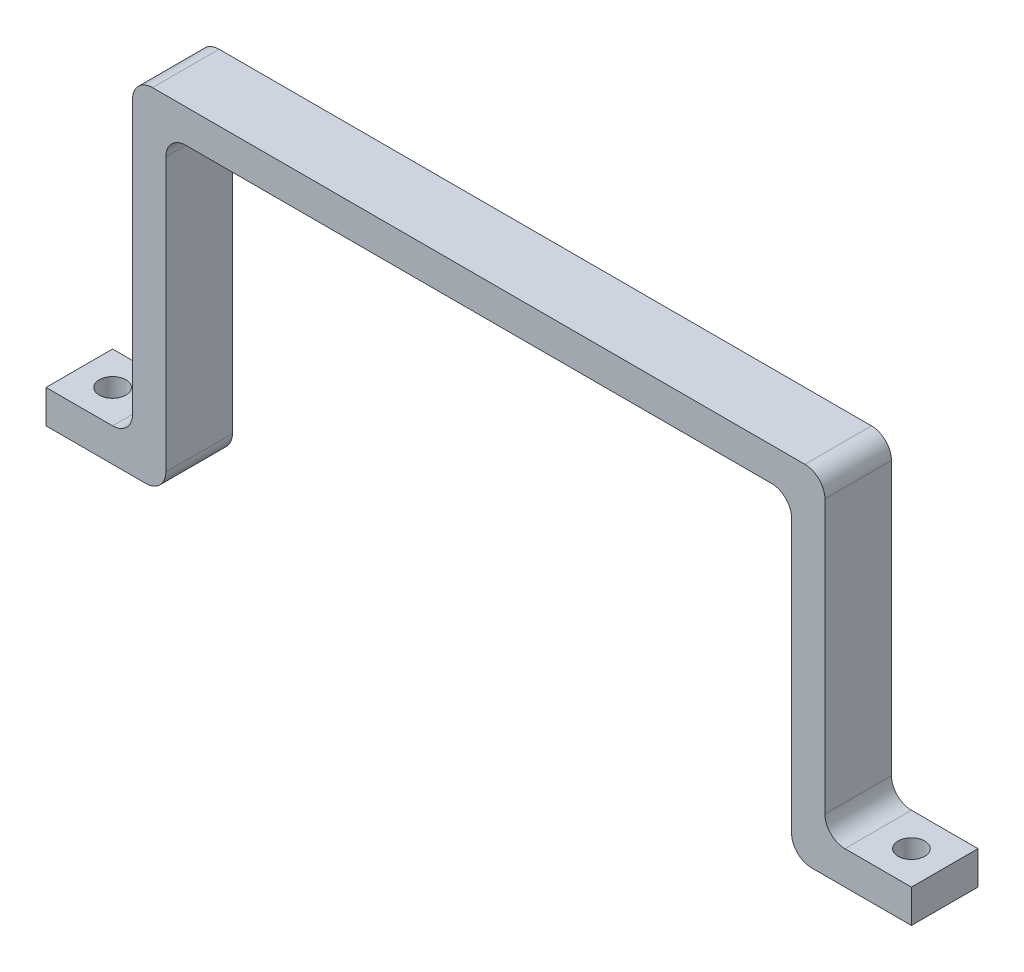
ISO-10303-21;
HEADER;
FILE_DESCRIPTION(('STEP AP214'),'2;1');
FILE_NAME('part.step','',(''),(''),'','','');
FILE_SCHEMA(('AUTOMOTIVE_DESIGN { 1 0 10303 214 1 1 1 1 }'));
ENDSEC;
DATA;
#1=APPLICATION_CONTEXT('core data for automotive mechanical design processes');
#2=APPLICATION_PROTOCOL_DEFINITION('international standard','automotive_design',2000,#1);
#3=PRODUCT_CONTEXT('',#1,'mechanical');
#4=PRODUCT('Part','Part','',(#3));
#5=PRODUCT_RELATED_PRODUCT_CATEGORY('part','',(#4));
#6=PRODUCT_DEFINITION_FORMATION('','',#4);
#7=PRODUCT_DEFINITION_CONTEXT('part definition',#1,'design');
#8=PRODUCT_DEFINITION('design','',#6,#7);
#9=PRODUCT_DEFINITION_SHAPE('','',#8);
#10=(LENGTH_UNIT() NAMED_UNIT(*) SI_UNIT(.MILLI.,.METRE.));
#11=(NAMED_UNIT(*) PLANE_ANGLE_UNIT() SI_UNIT($,.RADIAN.));
#12=(NAMED_UNIT(*) SI_UNIT($,.STERADIAN.) SOLID_ANGLE_UNIT());
#13=UNCERTAINTY_MEASURE_WITH_UNIT(LENGTH_MEASURE(1.E-05),#10,'distance_accuracy_value','');
#14=(GEOMETRIC_REPRESENTATION_CONTEXT(3) GLOBAL_UNCERTAINTY_ASSIGNED_CONTEXT((#13)) GLOBAL_UNIT_ASSIGNED_CONTEXT((#10,
#11,#12)) REPRESENTATION_CONTEXT('',''));
#15=CARTESIAN_POINT('',(0.,0.,0.));
#16=DIRECTION('',(0.,0.,1.));
#17=DIRECTION('',(1.,0.,0.));
#18=AXIS2_PLACEMENT_3D('',#15,#16,#17);
#19=CARTESIAN_POINT('',(65.,-18.5,10.));
#20=DIRECTION('',(-1.,0.,0.));
#21=DIRECTION('',(0.,0.,1.));
#22=AXIS2_PLACEMENT_3D('',#19,#20,#21);
#23=PLANE('',#22);
#24=DIRECTION('',(0.,1.,0.));
#25=VECTOR('',#24,1.);
#26=CARTESIAN_POINT('',(65.,-18.5,0.));
#27=LINE('',#26,#25);
#28=CARTESIAN_POINT('',(65.,-23.5,0.));
#29=VERTEX_POINT('',#28);
#30=CARTESIAN_POINT('',(65.,-18.5,0.));
#31=VERTEX_POINT('',#30);
#32=EDGE_CURVE('E205',#29,#31,#27,.T.);
#33=ORIENTED_EDGE('',*,*,#32,.T.);
#34=DIRECTION('',(0.,0.,-1.));
#35=VECTOR('',#34,1.);
#36=CARTESIAN_POINT('',(65.,-18.5,10.));
#37=LINE('',#36,#35);
#38=CARTESIAN_POINT('',(65.,-18.5,10.));
#39=VERTEX_POINT('',#38);
#40=EDGE_CURVE('E41',#39,#31,#37,.T.);
#41=ORIENTED_EDGE('',*,*,#40,.F.);
#42=DIRECTION('',(0.,1.,0.));
#43=VECTOR('',#42,1.);
#44=CARTESIAN_POINT('',(65.,-18.5,10.));
#45=LINE('',#44,#43);
#46=CARTESIAN_POINT('',(65.,-23.5,10.));
#47=VERTEX_POINT('',#46);
#48=EDGE_CURVE('E129',#47,#39,#45,.T.);
#49=ORIENTED_EDGE('',*,*,#48,.F.);
#50=DIRECTION('',(0.,0.,-1.));
#51=VECTOR('',#50,1.);
#52=CARTESIAN_POINT('',(65.,-23.5,10.));
#53=LINE('',#52,#51);
#54=EDGE_CURVE('E11',#47,#29,#53,.T.);
#55=ORIENTED_EDGE('',*,*,#54,.T.);
#56=EDGE_LOOP('',(#33,#41,#49,#55));
#57=FACE_BOUND('',#56,.T.);
#58=ADVANCED_FACE('F33',(#57),#23,.F.);
#59=CARTESIAN_POINT('',(55.,-18.5,10.));
#60=DIRECTION('',(0.,-1.,0.));
#61=DIRECTION('',(0.,0.,-1.));
#62=AXIS2_PLACEMENT_3D('',#59,#60,#61);
#63=PLANE('',#62);
#64=CARTESIAN_POINT('',(60.,-18.5,5.));
#65=DIRECTION('',(0.,1.,0.));
#66=DIRECTION('',(0.,0.,1.));
#67=AXIS2_PLACEMENT_3D('',#64,#65,#66);
#68=CIRCLE('',#67,2.);
#69=CARTESIAN_POINT('',(60.,-18.5,7.));
#70=VERTEX_POINT('',#69);
#71=EDGE_CURVE('E353',#70,#70,#68,.T.);
#72=ORIENTED_EDGE('',*,*,#71,.F.);
#73=EDGE_LOOP('',(#72));
#74=FACE_BOUND('',#73,.T.);
#75=DIRECTION('',(-1.,0.,0.));
#76=VECTOR('',#75,1.);
#77=CARTESIAN_POINT('',(55.,-18.5,0.));
#78=LINE('',#77,#76);
#79=CARTESIAN_POINT('',(55.,-18.5,0.));
#80=VERTEX_POINT('',#79);
#81=EDGE_CURVE('E207',#31,#80,#78,.T.);
#82=ORIENTED_EDGE('',*,*,#81,.T.);
#83=DIRECTION('',(0.,0.,-1.));
#84=VECTOR('',#83,1.);
#85=CARTESIAN_POINT('',(55.,-18.5,10.));
#86=LINE('',#85,#84);
#87=CARTESIAN_POINT('',(55.,-18.5,10.));
#88=VERTEX_POINT('',#87);
#89=EDGE_CURVE('E286',#88,#80,#86,.T.);
#90=ORIENTED_EDGE('',*,*,#89,.F.);
#91=DIRECTION('',(-1.,0.,0.));
#92=VECTOR('',#91,1.);
#93=CARTESIAN_POINT('',(55.,-18.5,10.));
#94=LINE('',#93,#92);
#95=EDGE_CURVE('E294',#39,#88,#94,.T.);
#96=ORIENTED_EDGE('',*,*,#95,.F.);
#97=ORIENTED_EDGE('',*,*,#40,.T.);
#98=EDGE_LOOP('',(#82,#90,#96,#97));
#99=FACE_BOUND('',#98,.T.);
#100=ADVANCED_FACE('F292',(#74,#99),#63,.F.);
#101=CARTESIAN_POINT('',(55.,-15.5,10.));
#102=DIRECTION('',(0.,0.,-1.));
#103=DIRECTION('',(-1.,0.,0.));
#104=AXIS2_PLACEMENT_3D('',#101,#102,#103);
#105=CYLINDRICAL_SURFACE('',#104,3.);
#106=CARTESIAN_POINT('',(55.,-15.5,0.));
#107=DIRECTION('',(0.,0.,-1.));
#108=DIRECTION('',(-1.,0.,0.));
#109=AXIS2_PLACEMENT_3D('',#106,#107,#108);
#110=CIRCLE('',#109,3.);
#111=CARTESIAN_POINT('',(52.,-15.5,0.));
#112=VERTEX_POINT('',#111);
#113=EDGE_CURVE('E210',#80,#112,#110,.T.);
#114=ORIENTED_EDGE('',*,*,#113,.T.);
#115=DIRECTION('',(0.,0.,-1.));
#116=VECTOR('',#115,1.);
#117=CARTESIAN_POINT('',(52.,-15.5,10.));
#118=LINE('',#117,#116);
#119=CARTESIAN_POINT('',(52.,-15.5,10.));
#120=VERTEX_POINT('',#119);
#121=EDGE_CURVE('E283',#120,#112,#118,.T.);
#122=ORIENTED_EDGE('',*,*,#121,.F.);
#123=CARTESIAN_POINT('',(55.,-15.5,10.));
#124=DIRECTION('',(0.,0.,-1.));
#125=DIRECTION('',(-1.,0.,0.));
#126=AXIS2_PLACEMENT_3D('',#123,#124,#125);
#127=CIRCLE('',#126,3.);
#128=EDGE_CURVE('E313',#88,#120,#127,.T.);
#129=ORIENTED_EDGE('',*,*,#128,.F.);
#130=ORIENTED_EDGE('',*,*,#89,.T.);
#131=EDGE_LOOP('',(#114,#122,#129,#130));
#132=FACE_BOUND('',#131,.T.);
#133=ADVANCED_FACE('F304',(#132),#105,.F.);
#134=CARTESIAN_POINT('',(52.,-15.5,10.));
#135=DIRECTION('',(-1.,0.,0.));
#136=DIRECTION('',(0.,-1.,0.));
#137=AXIS2_PLACEMENT_3D('',#134,#135,#136);
#138=PLANE('',#137);
#139=DIRECTION('',(0.,1.,0.));
#140=VECTOR('',#139,1.);
#141=CARTESIAN_POINT('',(52.,-15.5,0.));
#142=LINE('',#141,#140);
#143=CARTESIAN_POINT('',(52.,25.5,0.));
#144=VERTEX_POINT('',#143);
#145=EDGE_CURVE('E212',#112,#144,#142,.T.);
#146=ORIENTED_EDGE('',*,*,#145,.T.);
#147=DIRECTION('',(0.,0.,-1.));
#148=VECTOR('',#147,1.);
#149=CARTESIAN_POINT('',(52.,25.5,10.));
#150=LINE('',#149,#148);
#151=CARTESIAN_POINT('',(52.,25.5,10.));
#152=VERTEX_POINT('',#151);
#153=EDGE_CURVE('E280',#152,#144,#150,.T.);
#154=ORIENTED_EDGE('',*,*,#153,.F.);
#155=DIRECTION('',(0.,1.,0.));
#156=VECTOR('',#155,1.);
#157=CARTESIAN_POINT('',(52.,-15.5,10.));
#158=LINE('',#157,#156);
#159=EDGE_CURVE('E310',#120,#152,#158,.T.);
#160=ORIENTED_EDGE('',*,*,#159,.F.);
#161=ORIENTED_EDGE('',*,*,#121,.T.);
#162=EDGE_LOOP('',(#146,#154,#160,#161));
#163=FACE_BOUND('',#162,.T.);
#164=ADVANCED_FACE('F308',(#163),#138,.F.);
#165=CARTESIAN_POINT('',(49.,25.5,10.));
#166=DIRECTION('',(0.,0.,-1.));
#167=DIRECTION('',(-1.,0.,0.));
#168=AXIS2_PLACEMENT_3D('',#165,#166,#167);
#169=CYLINDRICAL_SURFACE('',#168,3.);
#170=CARTESIAN_POINT('',(49.,25.5,0.));
#171=DIRECTION('',(0.,0.,1.));
#172=DIRECTION('',(1.,0.,0.));
#173=AXIS2_PLACEMENT_3D('',#170,#171,#172);
#174=CIRCLE('',#173,3.);
#175=CARTESIAN_POINT('',(49.,28.5,0.));
#176=VERTEX_POINT('',#175);
#177=EDGE_CURVE('E214',#144,#176,#174,.T.);
#178=ORIENTED_EDGE('',*,*,#177,.T.);
#179=DIRECTION('',(0.,0.,-1.));
#180=VECTOR('',#179,1.);
#181=CARTESIAN_POINT('',(49.,28.5,10.));
#182=LINE('',#181,#180);
#183=CARTESIAN_POINT('',(49.,28.5,10.));
#184=VERTEX_POINT('',#183);
#185=EDGE_CURVE('E277',#184,#176,#182,.T.);
#186=ORIENTED_EDGE('',*,*,#185,.F.);
#187=CARTESIAN_POINT('',(49.,25.5,10.));
#188=DIRECTION('',(0.,0.,1.));
#189=DIRECTION('',(1.,0.,0.));
#190=AXIS2_PLACEMENT_3D('',#187,#188,#189);
#191=CIRCLE('',#190,3.);
#192=EDGE_CURVE('E312',#152,#184,#191,.T.);
#193=ORIENTED_EDGE('',*,*,#192,.F.);
#194=ORIENTED_EDGE('',*,*,#153,.T.);
#195=EDGE_LOOP('',(#178,#186,#193,#194));
#196=FACE_BOUND('',#195,.T.);
#197=ADVANCED_FACE('F417',(#196),#169,.T.);
#198=CARTESIAN_POINT('',(49.,28.5,10.));
#199=DIRECTION('',(0.,-1.,0.));
#200=DIRECTION('',(0.,0.,-1.));
#201=AXIS2_PLACEMENT_3D('',#198,#199,#200);
#202=PLANE('',#201);
#203=DIRECTION('',(-1.,0.,0.));
#204=VECTOR('',#203,1.);
#205=CARTESIAN_POINT('',(49.,28.5,0.));
#206=LINE('',#205,#204);
#207=CARTESIAN_POINT('',(-49.,28.5,0.));
#208=VERTEX_POINT('',#207);
#209=EDGE_CURVE('E216',#176,#208,#206,.T.);
#210=ORIENTED_EDGE('',*,*,#209,.T.);
#211=DIRECTION('',(0.,0.,-1.));
#212=VECTOR('',#211,1.);
#213=CARTESIAN_POINT('',(-49.,28.5,10.));
#214=LINE('',#213,#212);
#215=CARTESIAN_POINT('',(-49.,28.5,10.));
#216=VERTEX_POINT('',#215);
#217=EDGE_CURVE('E274',#216,#208,#214,.T.);
#218=ORIENTED_EDGE('',*,*,#217,.F.);
#219=DIRECTION('',(-1.,0.,0.));
#220=VECTOR('',#219,1.);
#221=CARTESIAN_POINT('',(49.,28.5,10.));
#222=LINE('',#221,#220);
#223=EDGE_CURVE('E315',#184,#216,#222,.T.);
#224=ORIENTED_EDGE('',*,*,#223,.F.);
#225=ORIENTED_EDGE('',*,*,#185,.T.);
#226=EDGE_LOOP('',(#210,#218,#224,#225));
#227=FACE_BOUND('',#226,.T.);
#228=ADVANCED_FACE('F414',(#227),#202,.F.);
#229=CARTESIAN_POINT('',(-49.,25.5,10.));
#230=DIRECTION('',(0.,0.,-1.));
#231=DIRECTION('',(-1.,0.,0.));
#232=AXIS2_PLACEMENT_3D('',#229,#230,#231);
#233=CYLINDRICAL_SURFACE('',#232,3.);
#234=CARTESIAN_POINT('',(-49.,25.5,0.));
#235=DIRECTION('',(0.,0.,1.));
#236=DIRECTION('',(1.,0.,0.));
#237=AXIS2_PLACEMENT_3D('',#234,#235,#236);
#238=CIRCLE('',#237,3.);
#239=CARTESIAN_POINT('',(-52.,25.5,0.));
#240=VERTEX_POINT('',#239);
#241=EDGE_CURVE('E218',#208,#240,#238,.T.);
#242=ORIENTED_EDGE('',*,*,#241,.T.);
#243=DIRECTION('',(0.,0.,-1.));
#244=VECTOR('',#243,1.);
#245=CARTESIAN_POINT('',(-52.,25.5,10.));
#246=LINE('',#245,#244);
#247=CARTESIAN_POINT('',(-52.,25.5,10.));
#248=VERTEX_POINT('',#247);
#249=EDGE_CURVE('E271',#248,#240,#246,.T.);
#250=ORIENTED_EDGE('',*,*,#249,.F.);
#251=CARTESIAN_POINT('',(-49.,25.5,10.));
#252=DIRECTION('',(0.,0.,1.));
#253=DIRECTION('',(1.,0.,0.));
#254=AXIS2_PLACEMENT_3D('',#251,#252,#253);
#255=CIRCLE('',#254,3.);
#256=EDGE_CURVE('E321',#216,#248,#255,.T.);
#257=ORIENTED_EDGE('',*,*,#256,.F.);
#258=ORIENTED_EDGE('',*,*,#217,.T.);
#259=EDGE_LOOP('',(#242,#250,#257,#258));
#260=FACE_BOUND('',#259,.T.);
#261=ADVANCED_FACE('F410',(#260),#233,.T.);
#262=CARTESIAN_POINT('',(-52.,-15.5,10.));
#263=DIRECTION('',(1.,0.,0.));
#264=DIRECTION('',(0.,0.,-1.));
#265=AXIS2_PLACEMENT_3D('',#262,#263,#264);
#266=PLANE('',#265);
#267=DIRECTION('',(0.,-1.,0.));
#268=VECTOR('',#267,1.);
#269=CARTESIAN_POINT('',(-52.,-15.5,0.));
#270=LINE('',#269,#268);
#271=CARTESIAN_POINT('',(-52.,-15.5,0.));
#272=VERTEX_POINT('',#271);
#273=EDGE_CURVE('E220',#240,#272,#270,.T.);
#274=ORIENTED_EDGE('',*,*,#273,.T.);
#275=DIRECTION('',(0.,0.,-1.));
#276=VECTOR('',#275,1.);
#277=CARTESIAN_POINT('',(-52.,-15.5,10.));
#278=LINE('',#277,#276);
#279=CARTESIAN_POINT('',(-52.,-15.5,10.));
#280=VERTEX_POINT('',#279);
#281=EDGE_CURVE('E268',#280,#272,#278,.T.);
#282=ORIENTED_EDGE('',*,*,#281,.F.);
#283=DIRECTION('',(0.,-1.,0.));
#284=VECTOR('',#283,1.);
#285=CARTESIAN_POINT('',(-52.,-15.5,10.));
#286=LINE('',#285,#284);
#287=EDGE_CURVE('E323',#248,#280,#286,.T.);
#288=ORIENTED_EDGE('',*,*,#287,.F.);
#289=ORIENTED_EDGE('',*,*,#249,.T.);
#290=EDGE_LOOP('',(#274,#282,#288,#289));
#291=FACE_BOUND('',#290,.T.);
#292=ADVANCED_FACE('F406',(#291),#266,.F.);
#293=CARTESIAN_POINT('',(-55.,-15.5,10.));
#294=DIRECTION('',(0.,0.,-1.));
#295=DIRECTION('',(-1.,0.,0.));
#296=AXIS2_PLACEMENT_3D('',#293,#294,#295);
#297=CYLINDRICAL_SURFACE('',#296,3.);
#298=CARTESIAN_POINT('',(-55.,-15.5,0.));
#299=DIRECTION('',(0.,0.,-1.));
#300=DIRECTION('',(-1.,0.,0.));
#301=AXIS2_PLACEMENT_3D('',#298,#299,#300);
#302=CIRCLE('',#301,3.);
#303=CARTESIAN_POINT('',(-55.,-18.5,0.));
#304=VERTEX_POINT('',#303);
#305=EDGE_CURVE('E222',#272,#304,#302,.T.);
#306=ORIENTED_EDGE('',*,*,#305,.T.);
#307=DIRECTION('',(0.,0.,-1.));
#308=VECTOR('',#307,1.);
#309=CARTESIAN_POINT('',(-55.,-18.5,10.));
#310=LINE('',#309,#308);
#311=CARTESIAN_POINT('',(-55.,-18.5,10.));
#312=VERTEX_POINT('',#311);
#313=EDGE_CURVE('E265',#312,#304,#310,.T.);
#314=ORIENTED_EDGE('',*,*,#313,.F.);
#315=CARTESIAN_POINT('',(-55.,-15.5,10.));
#316=DIRECTION('',(0.,0.,-1.));
#317=DIRECTION('',(-1.,0.,0.));
#318=AXIS2_PLACEMENT_3D('',#315,#316,#317);
#319=CIRCLE('',#318,3.);
#320=EDGE_CURVE('E325',#280,#312,#319,.T.);
#321=ORIENTED_EDGE('',*,*,#320,.F.);
#322=ORIENTED_EDGE('',*,*,#281,.T.);
#323=EDGE_LOOP('',(#306,#314,#321,#322));
#324=FACE_BOUND('',#323,.T.);
#325=ADVANCED_FACE('F379',(#324),#297,.F.);
#326=CARTESIAN_POINT('',(-55.,-18.5,10.));
#327=DIRECTION('',(0.,-1.,0.));
#328=DIRECTION('',(0.,0.,-1.));
#329=AXIS2_PLACEMENT_3D('',#326,#327,#328);
#330=PLANE('',#329);
#331=CARTESIAN_POINT('',(-60.,-18.5,5.));
#332=DIRECTION('',(0.,1.,0.));
#333=DIRECTION('',(0.,0.,1.));
#334=AXIS2_PLACEMENT_3D('',#331,#332,#333);
#335=CIRCLE('',#334,2.);
#336=CARTESIAN_POINT('',(-60.,-18.5,7.));
#337=VERTEX_POINT('',#336);
#338=EDGE_CURVE('E359',#337,#337,#335,.T.);
#339=ORIENTED_EDGE('',*,*,#338,.F.);
#340=EDGE_LOOP('',(#339));
#341=FACE_BOUND('',#340,.T.);
#342=DIRECTION('',(-1.,0.,0.));
#343=VECTOR('',#342,1.);
#344=CARTESIAN_POINT('',(-55.,-18.5,0.));
#345=LINE('',#344,#343);
#346=CARTESIAN_POINT('',(-65.,-18.5,0.));
#347=VERTEX_POINT('',#346);
#348=EDGE_CURVE('E224',#304,#347,#345,.T.);
#349=ORIENTED_EDGE('',*,*,#348,.T.);
#350=DIRECTION('',(0.,0.,-1.));
#351=VECTOR('',#350,1.);
#352=CARTESIAN_POINT('',(-65.,-18.5,10.));
#353=LINE('',#352,#351);
#354=CARTESIAN_POINT('',(-65.,-18.5,10.));
#355=VERTEX_POINT('',#354);
#356=EDGE_CURVE('E262',#355,#347,#353,.T.);
#357=ORIENTED_EDGE('',*,*,#356,.F.);
#358=DIRECTION('',(-1.,0.,0.));
#359=VECTOR('',#358,1.);
#360=CARTESIAN_POINT('',(-55.,-18.5,10.));
#361=LINE('',#360,#359);
#362=EDGE_CURVE('E327',#312,#355,#361,.T.);
#363=ORIENTED_EDGE('',*,*,#362,.F.);
#364=ORIENTED_EDGE('',*,*,#313,.T.);
#365=EDGE_LOOP('',(#349,#357,#363,#364));
#366=FACE_BOUND('',#365,.T.);
#367=ADVANCED_FACE('F375',(#341,#366),#330,.F.);
#368=CARTESIAN_POINT('',(-65.,-18.5,10.));
#369=DIRECTION('',(1.,0.,0.));
#370=DIRECTION('',(0.,0.,-1.));
#371=AXIS2_PLACEMENT_3D('',#368,#369,#370);
#372=PLANE('',#371);
#373=DIRECTION('',(0.,-1.,0.));
#374=VECTOR('',#373,1.);
#375=CARTESIAN_POINT('',(-65.,-18.5,0.));
#376=LINE('',#375,#374);
#377=CARTESIAN_POINT('',(-65.,-23.5,0.));
#378=VERTEX_POINT('',#377);
#379=EDGE_CURVE('E226',#347,#378,#376,.T.);
#380=ORIENTED_EDGE('',*,*,#379,.T.);
#381=DIRECTION('',(0.,0.,-1.));
#382=VECTOR('',#381,1.);
#383=CARTESIAN_POINT('',(-65.,-23.5,10.));
#384=LINE('',#383,#382);
#385=CARTESIAN_POINT('',(-65.,-23.5,10.));
#386=VERTEX_POINT('',#385);
#387=EDGE_CURVE('E259',#386,#378,#384,.T.);
#388=ORIENTED_EDGE('',*,*,#387,.F.);
#389=DIRECTION('',(0.,-1.,0.));
#390=VECTOR('',#389,1.);
#391=CARTESIAN_POINT('',(-65.,-18.5,10.));
#392=LINE('',#391,#390);
#393=EDGE_CURVE('E329',#355,#386,#392,.T.);
#394=ORIENTED_EDGE('',*,*,#393,.F.);
#395=ORIENTED_EDGE('',*,*,#356,.T.);
#396=EDGE_LOOP('',(#380,#388,#394,#395));
#397=FACE_BOUND('',#396,.T.);
#398=ADVANCED_FACE('F378',(#397),#372,.F.);
#399=CARTESIAN_POINT('',(-50.,-23.5,10.));
#400=DIRECTION('',(0.,1.,0.));
#401=DIRECTION('',(0.,0.,1.));
#402=AXIS2_PLACEMENT_3D('',#399,#400,#401);
#403=PLANE('',#402);
#404=CARTESIAN_POINT('',(-60.,-23.5,5.));
#405=DIRECTION('',(0.,1.,0.));
#406=DIRECTION('',(0.,0.,1.));
#407=AXIS2_PLACEMENT_3D('',#404,#405,#406);
#408=CIRCLE('',#407,2.);
#409=CARTESIAN_POINT('',(-60.,-23.5,7.));
#410=VERTEX_POINT('',#409);
#411=EDGE_CURVE('E208',#410,#410,#408,.T.);
#412=ORIENTED_EDGE('',*,*,#411,.T.);
#413=EDGE_LOOP('',(#412));
#414=FACE_BOUND('',#413,.T.);
#415=DIRECTION('',(1.,0.,0.));
#416=VECTOR('',#415,1.);
#417=CARTESIAN_POINT('',(-50.,-23.5,0.));
#418=LINE('',#417,#416);
#419=CARTESIAN_POINT('',(-50.,-23.5,0.));
#420=VERTEX_POINT('',#419);
#421=EDGE_CURVE('E229',#378,#420,#418,.T.);
#422=ORIENTED_EDGE('',*,*,#421,.T.);
#423=DIRECTION('',(0.,0.,-1.));
#424=VECTOR('',#423,1.);
#425=CARTESIAN_POINT('',(-50.,-23.5,10.));
#426=LINE('',#425,#424);
#427=CARTESIAN_POINT('',(-50.,-23.5,10.));
#428=VERTEX_POINT('',#427);
#429=EDGE_CURVE('E256',#428,#420,#426,.T.);
#430=ORIENTED_EDGE('',*,*,#429,.F.);
#431=DIRECTION('',(1.,0.,0.));
#432=VECTOR('',#431,1.);
#433=CARTESIAN_POINT('',(-65.,-23.5,10.));
#434=LINE('',#433,#432);
#435=EDGE_CURVE('E331',#386,#428,#434,.T.);
#436=ORIENTED_EDGE('',*,*,#435,.F.);
#437=ORIENTED_EDGE('',*,*,#387,.T.);
#438=EDGE_LOOP('',(#422,#430,#436,#437));
#439=FACE_BOUND('',#438,.T.);
#440=ADVANCED_FACE('F365',(#414,#439),#403,.F.);
#441=CARTESIAN_POINT('',(-50.,-20.5,10.));
#442=DIRECTION('',(0.,0.,-1.));
#443=DIRECTION('',(-1.,0.,0.));
#444=AXIS2_PLACEMENT_3D('',#441,#442,#443);
#445=CYLINDRICAL_SURFACE('',#444,3.);
#446=CARTESIAN_POINT('',(-50.,-20.5,0.));
#447=DIRECTION('',(0.,0.,1.));
#448=DIRECTION('',(1.,0.,0.));
#449=AXIS2_PLACEMENT_3D('',#446,#447,#448);
#450=CIRCLE('',#449,3.);
#451=CARTESIAN_POINT('',(-47.,-20.5,0.));
#452=VERTEX_POINT('',#451);
#453=EDGE_CURVE('E231',#420,#452,#450,.T.);
#454=ORIENTED_EDGE('',*,*,#453,.T.);
#455=DIRECTION('',(0.,0.,-1.));
#456=VECTOR('',#455,1.);
#457=CARTESIAN_POINT('',(-47.,-20.5,10.));
#458=LINE('',#457,#456);
#459=CARTESIAN_POINT('',(-47.,-20.5,10.));
#460=VERTEX_POINT('',#459);
#461=EDGE_CURVE('E253',#460,#452,#458,.T.);
#462=ORIENTED_EDGE('',*,*,#461,.F.);
#463=CARTESIAN_POINT('',(-50.,-20.5,10.));
#464=DIRECTION('',(0.,0.,1.));
#465=DIRECTION('',(1.,0.,0.));
#466=AXIS2_PLACEMENT_3D('',#463,#464,#465);
#467=CIRCLE('',#466,3.);
#468=EDGE_CURVE('E333',#428,#460,#467,.T.);
#469=ORIENTED_EDGE('',*,*,#468,.F.);
#470=ORIENTED_EDGE('',*,*,#429,.T.);
#471=EDGE_LOOP('',(#454,#462,#469,#470));
#472=FACE_BOUND('',#471,.T.);
#473=ADVANCED_FACE('F396',(#472),#445,.T.);
#474=CARTESIAN_POINT('',(-47.,-20.5,10.));
#475=DIRECTION('',(-1.,0.,0.));
#476=DIRECTION('',(0.,0.,1.));
#477=AXIS2_PLACEMENT_3D('',#474,#475,#476);
#478=PLANE('',#477);
#479=DIRECTION('',(0.,1.,0.));
#480=VECTOR('',#479,1.);
#481=CARTESIAN_POINT('',(-47.,-20.5,0.));
#482=LINE('',#481,#480);
#483=CARTESIAN_POINT('',(-47.,20.5,0.));
#484=VERTEX_POINT('',#483);
#485=EDGE_CURVE('E233',#452,#484,#482,.T.);
#486=ORIENTED_EDGE('',*,*,#485,.T.);
#487=DIRECTION('',(0.,0.,-1.));
#488=VECTOR('',#487,1.);
#489=CARTESIAN_POINT('',(-47.,20.5,10.));
#490=LINE('',#489,#488);
#491=CARTESIAN_POINT('',(-47.,20.5,10.));
#492=VERTEX_POINT('',#491);
#493=EDGE_CURVE('E250',#492,#484,#490,.T.);
#494=ORIENTED_EDGE('',*,*,#493,.F.);
#495=DIRECTION('',(0.,1.,0.));
#496=VECTOR('',#495,1.);
#497=CARTESIAN_POINT('',(-47.,-20.5,10.));
#498=LINE('',#497,#496);
#499=EDGE_CURVE('E335',#460,#492,#498,.T.);
#500=ORIENTED_EDGE('',*,*,#499,.F.);
#501=ORIENTED_EDGE('',*,*,#461,.T.);
#502=EDGE_LOOP('',(#486,#494,#500,#501));
#503=FACE_BOUND('',#502,.T.);
#504=ADVANCED_FACE('F461',(#503),#478,.F.);
#505=CARTESIAN_POINT('',(-44.,20.5,10.));
#506=DIRECTION('',(0.,0.,-1.));
#507=DIRECTION('',(-1.,0.,0.));
#508=AXIS2_PLACEMENT_3D('',#505,#506,#507);
#509=CYLINDRICAL_SURFACE('',#508,3.);
#510=CARTESIAN_POINT('',(-44.,20.5,0.));
#511=DIRECTION('',(0.,0.,-1.));
#512=DIRECTION('',(1.,0.,0.));
#513=AXIS2_PLACEMENT_3D('',#510,#511,#512);
#514=CIRCLE('',#513,3.);
#515=CARTESIAN_POINT('',(-44.,23.5,0.));
#516=VERTEX_POINT('',#515);
#517=EDGE_CURVE('E235',#484,#516,#514,.T.);
#518=ORIENTED_EDGE('',*,*,#517,.T.);
#519=DIRECTION('',(0.,0.,-1.));
#520=VECTOR('',#519,1.);
#521=CARTESIAN_POINT('',(-44.,23.5,10.));
#522=LINE('',#521,#520);
#523=CARTESIAN_POINT('',(-44.,23.5,10.));
#524=VERTEX_POINT('',#523);
#525=EDGE_CURVE('E247',#524,#516,#522,.T.);
#526=ORIENTED_EDGE('',*,*,#525,.F.);
#527=CARTESIAN_POINT('',(-44.,20.5,10.));
#528=DIRECTION('',(0.,0.,-1.));
#529=DIRECTION('',(1.,0.,0.));
#530=AXIS2_PLACEMENT_3D('',#527,#528,#529);
#531=CIRCLE('',#530,3.);
#532=EDGE_CURVE('E337',#492,#524,#531,.T.);
#533=ORIENTED_EDGE('',*,*,#532,.F.);
#534=ORIENTED_EDGE('',*,*,#493,.T.);
#535=EDGE_LOOP('',(#518,#526,#533,#534));
#536=FACE_BOUND('',#535,.T.);
#537=ADVANCED_FACE('F343',(#536),#509,.F.);
#538=CARTESIAN_POINT('',(44.,23.5,10.));
#539=DIRECTION('',(0.,1.,0.));
#540=DIRECTION('',(-1.,0.,0.));
#541=AXIS2_PLACEMENT_3D('',#538,#539,#540);
#542=PLANE('',#541);
#543=DIRECTION('',(1.,0.,0.));
#544=VECTOR('',#543,1.);
#545=CARTESIAN_POINT('',(44.,23.5,0.));
#546=LINE('',#545,#544);
#547=CARTESIAN_POINT('',(44.,23.5,0.));
#548=VERTEX_POINT('',#547);
#549=EDGE_CURVE('E237',#516,#548,#546,.T.);
#550=ORIENTED_EDGE('',*,*,#549,.T.);
#551=DIRECTION('',(0.,0.,-1.));
#552=VECTOR('',#551,1.);
#553=CARTESIAN_POINT('',(44.,23.5,10.));
#554=LINE('',#553,#552);
#555=CARTESIAN_POINT('',(44.,23.5,10.));
#556=VERTEX_POINT('',#555);
#557=EDGE_CURVE('E194',#556,#548,#554,.T.);
#558=ORIENTED_EDGE('',*,*,#557,.F.);
#559=DIRECTION('',(1.,0.,0.));
#560=VECTOR('',#559,1.);
#561=CARTESIAN_POINT('',(44.,23.5,10.));
#562=LINE('',#561,#560);
#563=EDGE_CURVE('E185',#524,#556,#562,.T.);
#564=ORIENTED_EDGE('',*,*,#563,.F.);
#565=ORIENTED_EDGE('',*,*,#525,.T.);
#566=EDGE_LOOP('',(#550,#558,#564,#565));
#567=FACE_BOUND('',#566,.T.);
#568=ADVANCED_FACE('F347',(#567),#542,.F.);
#569=CARTESIAN_POINT('',(44.,20.5,10.));
#570=DIRECTION('',(0.,0.,-1.));
#571=DIRECTION('',(-1.,0.,0.));
#572=AXIS2_PLACEMENT_3D('',#569,#570,#571);
#573=CYLINDRICAL_SURFACE('',#572,3.);
#574=CARTESIAN_POINT('',(44.,20.5,0.));
#575=DIRECTION('',(0.,0.,-1.));
#576=DIRECTION('',(1.,0.,0.));
#577=AXIS2_PLACEMENT_3D('',#574,#575,#576);
#578=CIRCLE('',#577,3.);
#579=CARTESIAN_POINT('',(47.,20.5,0.));
#580=VERTEX_POINT('',#579);
#581=EDGE_CURVE('E193',#548,#580,#578,.T.);
#582=ORIENTED_EDGE('',*,*,#581,.T.);
#583=DIRECTION('',(0.,0.,-1.));
#584=VECTOR('',#583,1.);
#585=CARTESIAN_POINT('',(47.,20.5,10.));
#586=LINE('',#585,#584);
#587=CARTESIAN_POINT('',(47.,20.5,10.));
#588=VERTEX_POINT('',#587);
#589=EDGE_CURVE('E190',#588,#580,#586,.T.);
#590=ORIENTED_EDGE('',*,*,#589,.F.);
#591=CARTESIAN_POINT('',(44.,20.5,10.));
#592=DIRECTION('',(0.,0.,-1.));
#593=DIRECTION('',(1.,0.,0.));
#594=AXIS2_PLACEMENT_3D('',#591,#592,#593);
#595=CIRCLE('',#594,3.);
#596=EDGE_CURVE('E179',#556,#588,#595,.T.);
#597=ORIENTED_EDGE('',*,*,#596,.F.);
#598=ORIENTED_EDGE('',*,*,#557,.T.);
#599=EDGE_LOOP('',(#582,#590,#597,#598));
#600=FACE_BOUND('',#599,.T.);
#601=ADVANCED_FACE('F191',(#600),#573,.F.);
#602=CARTESIAN_POINT('',(47.,-20.5,10.));
#603=DIRECTION('',(1.,0.,0.));
#604=DIRECTION('',(0.,0.,-1.));
#605=AXIS2_PLACEMENT_3D('',#602,#603,#604);
#606=PLANE('',#605);
#607=DIRECTION('',(0.,-1.,0.));
#608=VECTOR('',#607,1.);
#609=CARTESIAN_POINT('',(47.,-20.5,0.));
#610=LINE('',#609,#608);
#611=CARTESIAN_POINT('',(47.,-20.5,0.));
#612=VERTEX_POINT('',#611);
#613=EDGE_CURVE('E115',#580,#612,#610,.T.);
#614=ORIENTED_EDGE('',*,*,#613,.T.);
#615=DIRECTION('',(0.,0.,-1.));
#616=VECTOR('',#615,1.);
#617=CARTESIAN_POINT('',(47.,-20.5,10.));
#618=LINE('',#617,#616);
#619=CARTESIAN_POINT('',(47.,-20.5,10.));
#620=VERTEX_POINT('',#619);
#621=EDGE_CURVE('E195',#620,#612,#618,.T.);
#622=ORIENTED_EDGE('',*,*,#621,.F.);
#623=DIRECTION('',(0.,-1.,0.));
#624=VECTOR('',#623,1.);
#625=CARTESIAN_POINT('',(47.,-20.5,10.));
#626=LINE('',#625,#624);
#627=EDGE_CURVE('E183',#588,#620,#626,.T.);
#628=ORIENTED_EDGE('',*,*,#627,.F.);
#629=ORIENTED_EDGE('',*,*,#589,.T.);
#630=EDGE_LOOP('',(#614,#622,#628,#629));
#631=FACE_BOUND('',#630,.T.);
#632=ADVANCED_FACE('F197',(#631),#606,.F.);
#633=CARTESIAN_POINT('',(50.,-20.5,10.));
#634=DIRECTION('',(0.,0.,-1.));
#635=DIRECTION('',(-1.,0.,0.));
#636=AXIS2_PLACEMENT_3D('',#633,#634,#635);
#637=CYLINDRICAL_SURFACE('',#636,3.);
#638=CARTESIAN_POINT('',(50.,-20.5,0.));
#639=DIRECTION('',(0.,0.,1.));
#640=DIRECTION('',(-1.,0.,0.));
#641=AXIS2_PLACEMENT_3D('',#638,#639,#640);
#642=CIRCLE('',#641,3.);
#643=CARTESIAN_POINT('',(50.,-23.5,0.));
#644=VERTEX_POINT('',#643);
#645=EDGE_CURVE('E122',#612,#644,#642,.T.);
#646=ORIENTED_EDGE('',*,*,#645,.T.);
#647=DIRECTION('',(0.,0.,-1.));
#648=VECTOR('',#647,1.);
#649=CARTESIAN_POINT('',(50.,-23.5,10.));
#650=LINE('',#649,#648);
#651=CARTESIAN_POINT('',(50.,-23.5,10.));
#652=VERTEX_POINT('',#651);
#653=EDGE_CURVE('E201',#652,#644,#650,.T.);
#654=ORIENTED_EDGE('',*,*,#653,.F.);
#655=CARTESIAN_POINT('',(50.,-20.5,10.));
#656=DIRECTION('',(0.,0.,1.));
#657=DIRECTION('',(-1.,0.,0.));
#658=AXIS2_PLACEMENT_3D('',#655,#656,#657);
#659=CIRCLE('',#658,3.);
#660=EDGE_CURVE('E199',#620,#652,#659,.T.);
#661=ORIENTED_EDGE('',*,*,#660,.F.);
#662=ORIENTED_EDGE('',*,*,#621,.T.);
#663=EDGE_LOOP('',(#646,#654,#661,#662));
#664=FACE_BOUND('',#663,.T.);
#665=ADVANCED_FACE('F349',(#664),#637,.T.);
#666=CARTESIAN_POINT('',(50.,-23.5,10.));
#667=DIRECTION('',(0.,1.,0.));
#668=DIRECTION('',(0.,0.,1.));
#669=AXIS2_PLACEMENT_3D('',#666,#667,#668);
#670=PLANE('',#669);
#671=CARTESIAN_POINT('',(60.,-23.5,5.));
#672=DIRECTION('',(0.,1.,0.));
#673=DIRECTION('',(0.,0.,1.));
#674=AXIS2_PLACEMENT_3D('',#671,#672,#673);
#675=CIRCLE('',#674,2.);
#676=CARTESIAN_POINT('',(60.,-23.5,7.));
#677=VERTEX_POINT('',#676);
#678=EDGE_CURVE('E356',#677,#677,#675,.T.);
#679=ORIENTED_EDGE('',*,*,#678,.T.);
#680=EDGE_LOOP('',(#679));
#681=FACE_BOUND('',#680,.T.);
#682=DIRECTION('',(1.,0.,0.));
#683=VECTOR('',#682,1.);
#684=CARTESIAN_POINT('',(50.,-23.5,0.));
#685=LINE('',#684,#683);
#686=EDGE_CURVE('E242',#644,#29,#685,.T.);
#687=ORIENTED_EDGE('',*,*,#686,.T.);
#688=ORIENTED_EDGE('',*,*,#54,.F.);
#689=DIRECTION('',(1.,0.,0.));
#690=VECTOR('',#689,1.);
#691=CARTESIAN_POINT('',(65.,-23.5,10.));
#692=LINE('',#691,#690);
#693=EDGE_CURVE('E49',#652,#47,#692,.T.);
#694=ORIENTED_EDGE('',*,*,#693,.F.);
#695=ORIENTED_EDGE('',*,*,#653,.T.);
#696=EDGE_LOOP('',(#687,#688,#694,#695));
#697=FACE_BOUND('',#696,.T.);
#698=ADVANCED_FACE('F348',(#681,#697),#670,.F.);
#699=CARTESIAN_POINT('',(50.,-20.5,10.));
#700=DIRECTION('',(0.,0.,-1.));
#701=DIRECTION('',(-1.,0.,0.));
#702=AXIS2_PLACEMENT_3D('',#699,#700,#701);
#703=PLANE('',#702);
#704=ORIENTED_EDGE('',*,*,#693,.T.);
#705=ORIENTED_EDGE('',*,*,#48,.T.);
#706=ORIENTED_EDGE('',*,*,#95,.T.);
#707=ORIENTED_EDGE('',*,*,#128,.T.);
#708=ORIENTED_EDGE('',*,*,#159,.T.);
#709=ORIENTED_EDGE('',*,*,#192,.T.);
#710=ORIENTED_EDGE('',*,*,#223,.T.);
#711=ORIENTED_EDGE('',*,*,#256,.T.);
#712=ORIENTED_EDGE('',*,*,#287,.T.);
#713=ORIENTED_EDGE('',*,*,#320,.T.);
#714=ORIENTED_EDGE('',*,*,#362,.T.);
#715=ORIENTED_EDGE('',*,*,#393,.T.);
#716=ORIENTED_EDGE('',*,*,#435,.T.);
#717=ORIENTED_EDGE('',*,*,#468,.T.);
#718=ORIENTED_EDGE('',*,*,#499,.T.);
#719=ORIENTED_EDGE('',*,*,#532,.T.);
#720=ORIENTED_EDGE('',*,*,#563,.T.);
#721=ORIENTED_EDGE('',*,*,#596,.T.);
#722=ORIENTED_EDGE('',*,*,#627,.T.);
#723=ORIENTED_EDGE('',*,*,#660,.T.);
#724=EDGE_LOOP('',(#704,#705,#706,#707,#708,#709,#710,#711,#712,#713,#714,#715,#716,#717,#718,
#719,#720,#721,#722,#723));
#725=FACE_BOUND('',#724,.T.);
#726=ADVANCED_FACE('F181',(#725),#703,.F.);
#727=CARTESIAN_POINT('',(50.,-20.5,0.));
#728=DIRECTION('',(0.,0.,-1.));
#729=DIRECTION('',(-1.,0.,0.));
#730=AXIS2_PLACEMENT_3D('',#727,#728,#729);
#731=PLANE('',#730);
#732=ORIENTED_EDGE('',*,*,#32,.F.);
#733=ORIENTED_EDGE('',*,*,#686,.F.);
#734=ORIENTED_EDGE('',*,*,#645,.F.);
#735=ORIENTED_EDGE('',*,*,#613,.F.);
#736=ORIENTED_EDGE('',*,*,#581,.F.);
#737=ORIENTED_EDGE('',*,*,#549,.F.);
#738=ORIENTED_EDGE('',*,*,#517,.F.);
#739=ORIENTED_EDGE('',*,*,#485,.F.);
#740=ORIENTED_EDGE('',*,*,#453,.F.);
#741=ORIENTED_EDGE('',*,*,#421,.F.);
#742=ORIENTED_EDGE('',*,*,#379,.F.);
#743=ORIENTED_EDGE('',*,*,#348,.F.);
#744=ORIENTED_EDGE('',*,*,#305,.F.);
#745=ORIENTED_EDGE('',*,*,#273,.F.);
#746=ORIENTED_EDGE('',*,*,#241,.F.);
#747=ORIENTED_EDGE('',*,*,#209,.F.);
#748=ORIENTED_EDGE('',*,*,#177,.F.);
#749=ORIENTED_EDGE('',*,*,#145,.F.);
#750=ORIENTED_EDGE('',*,*,#113,.F.);
#751=ORIENTED_EDGE('',*,*,#81,.F.);
#752=EDGE_LOOP('',(#732,#733,#734,#735,#736,#737,#738,#739,#740,#741,#742,#743,#744,#745,#746,
#747,#748,#749,#750,#751));
#753=FACE_BOUND('',#752,.T.);
#754=ADVANCED_FACE('F298',(#753),#731,.T.);
#755=CARTESIAN_POINT('',(60.,-23.5,5.));
#756=DIRECTION('',(0.,1.,0.));
#757=DIRECTION('',(0.,0.,1.));
#758=AXIS2_PLACEMENT_3D('',#755,#756,#757);
#759=CYLINDRICAL_SURFACE('',#758,2.);
#760=ORIENTED_EDGE('',*,*,#678,.F.);
#761=EDGE_LOOP('',(#760));
#762=FACE_BOUND('',#761,.T.);
#763=ORIENTED_EDGE('',*,*,#71,.T.);
#764=EDGE_LOOP('',(#763));
#765=FACE_BOUND('',#764,.T.);
#766=ADVANCED_FACE('F371',(#762,#765),#759,.F.);
#767=CARTESIAN_POINT('',(-60.,-23.5,5.));
#768=DIRECTION('',(0.,1.,0.));
#769=DIRECTION('',(0.,0.,1.));
#770=AXIS2_PLACEMENT_3D('',#767,#768,#769);
#771=CYLINDRICAL_SURFACE('',#770,2.);
#772=ORIENTED_EDGE('',*,*,#411,.F.);
#773=EDGE_LOOP('',(#772));
#774=FACE_BOUND('',#773,.T.);
#775=ORIENTED_EDGE('',*,*,#338,.T.);
#776=EDGE_LOOP('',(#775));
#777=FACE_BOUND('',#776,.T.);
#778=ADVANCED_FACE('F368',(#774,#777),#771,.F.);
#779=CLOSED_SHELL('',(#58,#100,#133,#164,#197,#228,#261,#292,#325,#367,#398,#440,#473,#504,#537,
#568,#601,#632,#665,#698,#726,#754,#766,#778));
#780=MANIFOLD_SOLID_BREP('B2',#779);
#781=ADVANCED_BREP_SHAPE_REPRESENTATION('',(#18,#780),#14);
#782=SHAPE_DEFINITION_REPRESENTATION(#9,#781);
ENDSEC;
END-ISO-10303-21;
